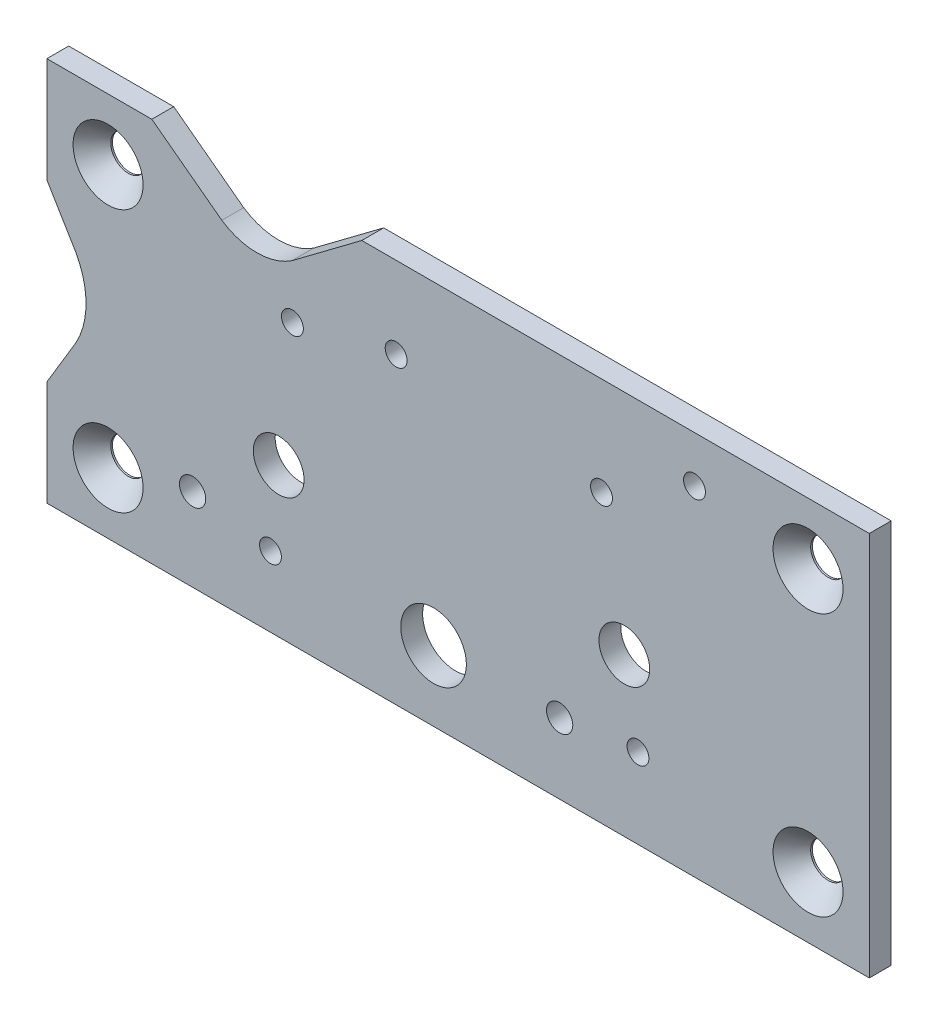
ISO-10303-21;
HEADER;
FILE_DESCRIPTION(('STEP AP214'),'2;1');
FILE_NAME('part.step','',(''),(''),'','','');
FILE_SCHEMA(('AUTOMOTIVE_DESIGN { 1 0 10303 214 1 1 1 1 }'));
ENDSEC;
DATA;
#1=APPLICATION_CONTEXT('core data for automotive mechanical design processes');
#2=APPLICATION_PROTOCOL_DEFINITION('international standard','automotive_design',2000,#1);
#3=PRODUCT_CONTEXT('',#1,'mechanical');
#4=PRODUCT('Part','Part','',(#3));
#5=PRODUCT_RELATED_PRODUCT_CATEGORY('part','',(#4));
#6=PRODUCT_DEFINITION_FORMATION('','',#4);
#7=PRODUCT_DEFINITION_CONTEXT('part definition',#1,'design');
#8=PRODUCT_DEFINITION('design','',#6,#7);
#9=PRODUCT_DEFINITION_SHAPE('','',#8);
#10=(LENGTH_UNIT() NAMED_UNIT(*) SI_UNIT(.MILLI.,.METRE.));
#11=(NAMED_UNIT(*) PLANE_ANGLE_UNIT() SI_UNIT($,.RADIAN.));
#12=(NAMED_UNIT(*) SI_UNIT($,.STERADIAN.) SOLID_ANGLE_UNIT());
#13=UNCERTAINTY_MEASURE_WITH_UNIT(LENGTH_MEASURE(1.E-05),#10,'distance_accuracy_value','');
#14=(GEOMETRIC_REPRESENTATION_CONTEXT(3) GLOBAL_UNCERTAINTY_ASSIGNED_CONTEXT((#13)) GLOBAL_UNIT_ASSIGNED_CONTEXT((#10,
#11,#12)) REPRESENTATION_CONTEXT('',''));
#15=CARTESIAN_POINT('',(0.,0.,0.));
#16=DIRECTION('',(0.,0.,1.));
#17=DIRECTION('',(1.,0.,0.));
#18=AXIS2_PLACEMENT_3D('',#15,#16,#17);
#19=CARTESIAN_POINT('',(47.,22.,0.));
#20=DIRECTION('',(0.,0.,-1.));
#21=DIRECTION('',(-1.,0.,0.));
#22=AXIS2_PLACEMENT_3D('',#19,#20,#21);
#23=PLANE('',#22);
#24=CARTESIAN_POINT('',(16.39527734,10.7721163,0.));
#25=DIRECTION('',(0.,0.,1.));
#26=DIRECTION('',(1.,0.,0.));
#27=AXIS2_PLACEMENT_3D('',#24,#25,#26);
#28=CIRCLE('',#27,1.24999999999999);
#29=CARTESIAN_POINT('',(17.64527734,10.7721163,0.));
#30=VERTEX_POINT('',#29);
#31=EDGE_CURVE('E755',#30,#30,#28,.T.);
#32=ORIENTED_EDGE('',*,*,#31,.F.);
#33=EDGE_LOOP('',(#32));
#34=FACE_BOUND('',#33,.T.);
#35=CARTESIAN_POINT('',(11.61273973,-13.9336995,0.));
#36=DIRECTION('',(0.,0.,1.));
#37=DIRECTION('',(1.,0.,0.));
#38=AXIS2_PLACEMENT_3D('',#35,#36,#37);
#39=CIRCLE('',#38,1.5);
#40=CARTESIAN_POINT('',(13.11273973,-13.9336995,0.));
#41=VERTEX_POINT('',#40);
#42=EDGE_CURVE('E759',#41,#41,#39,.T.);
#43=ORIENTED_EDGE('',*,*,#42,.F.);
#44=EDGE_LOOP('',(#43));
#45=FACE_BOUND('',#44,.T.);
#46=CARTESIAN_POINT('',(27.02597378,16.70830135,0.));
#47=DIRECTION('',(0.,0.,1.));
#48=DIRECTION('',(1.,0.,0.));
#49=AXIS2_PLACEMENT_3D('',#46,#47,#48);
#50=CIRCLE('',#49,1.24999999999999);
#51=CARTESIAN_POINT('',(28.27597378,16.70830135,0.));
#52=VERTEX_POINT('',#51);
#53=EDGE_CURVE('E775',#52,#52,#50,.T.);
#54=ORIENTED_EDGE('',*,*,#53,.F.);
#55=EDGE_LOOP('',(#54));
#56=FACE_BOUND('',#55,.T.);
#57=CARTESIAN_POINT('',(-30.339189,-12.51267994,0.));
#58=DIRECTION('',(0.,0.,1.));
#59=DIRECTION('',(1.,0.,0.));
#60=AXIS2_PLACEMENT_3D('',#57,#58,#59);
#61=CIRCLE('',#60,1.5);
#62=CARTESIAN_POINT('',(-28.839189,-12.51267994,0.));
#63=VERTEX_POINT('',#62);
#64=EDGE_CURVE('E707',#63,#63,#61,.T.);
#65=ORIENTED_EDGE('',*,*,#64,.F.);
#66=EDGE_LOOP('',(#65));
#67=FACE_BOUND('',#66,.T.);
#68=CARTESIAN_POINT('',(-18.93207305,9.91782843,0.));
#69=DIRECTION('',(0.,0.,1.));
#70=DIRECTION('',(1.,0.,0.));
#71=AXIS2_PLACEMENT_3D('',#68,#69,#70);
#72=CIRCLE('',#71,1.24999999999999);
#73=CARTESIAN_POINT('',(-17.68207305,9.91782843,0.));
#74=VERTEX_POINT('',#73);
#75=EDGE_CURVE('E721',#74,#74,#72,.T.);
#76=ORIENTED_EDGE('',*,*,#75,.F.);
#77=EDGE_LOOP('',(#76));
#78=FACE_BOUND('',#77,.T.);
#79=CARTESIAN_POINT('',(19.,-4.,0.));
#80=DIRECTION('',(0.,0.,1.));
#81=DIRECTION('',(1.,0.,0.));
#82=AXIS2_PLACEMENT_3D('',#79,#80,#81);
#83=CIRCLE('',#82,2.9);
#84=CARTESIAN_POINT('',(21.9,-4.,0.));
#85=VERTEX_POINT('',#84);
#86=EDGE_CURVE('E735',#85,#85,#83,.T.);
#87=ORIENTED_EDGE('',*,*,#86,.F.);
#88=EDGE_LOOP('',(#87));
#89=FACE_BOUND('',#88,.T.);
#90=CARTESIAN_POINT('',(-20.5,-5.,0.));
#91=DIRECTION('',(0.,0.,1.));
#92=DIRECTION('',(1.,0.,0.));
#93=AXIS2_PLACEMENT_3D('',#90,#91,#92);
#94=CIRCLE('',#93,2.9);
#95=CARTESIAN_POINT('',(-17.6,-5.,0.));
#96=VERTEX_POINT('',#95);
#97=EDGE_CURVE('E740',#96,#96,#94,.T.);
#98=ORIENTED_EDGE('',*,*,#97,.F.);
#99=EDGE_LOOP('',(#98));
#100=FACE_BOUND('',#99,.T.);
#101=CARTESIAN_POINT('',(-40.,-15.,0.));
#102=DIRECTION('',(0.,0.,1.));
#103=DIRECTION('',(1.,0.,0.));
#104=AXIS2_PLACEMENT_3D('',#101,#102,#103);
#105=CIRCLE('',#104,4.);
#106=CARTESIAN_POINT('',(-36.,-15.,0.));
#107=VERTEX_POINT('',#106);
#108=EDGE_CURVE('E249',#107,#107,#105,.T.);
#109=ORIENTED_EDGE('',*,*,#108,.F.);
#110=EDGE_LOOP('',(#109));
#111=FACE_BOUND('',#110,.T.);
#112=CARTESIAN_POINT('',(40.,-15.,0.));
#113=DIRECTION('',(0.,0.,1.));
#114=DIRECTION('',(1.,0.,0.));
#115=AXIS2_PLACEMENT_3D('',#112,#113,#114);
#116=CIRCLE('',#115,4.);
#117=CARTESIAN_POINT('',(44.,-15.,0.));
#118=VERTEX_POINT('',#117);
#119=EDGE_CURVE('E263',#118,#118,#116,.T.);
#120=ORIENTED_EDGE('',*,*,#119,.F.);
#121=EDGE_LOOP('',(#120));
#122=FACE_BOUND('',#121,.T.);
#123=CARTESIAN_POINT('',(40.,15.,0.));
#124=DIRECTION('',(0.,0.,1.));
#125=DIRECTION('',(1.,0.,0.));
#126=AXIS2_PLACEMENT_3D('',#123,#124,#125);
#127=CIRCLE('',#126,4.);
#128=CARTESIAN_POINT('',(44.,15.,0.));
#129=VERTEX_POINT('',#128);
#130=EDGE_CURVE('E275',#129,#129,#127,.T.);
#131=ORIENTED_EDGE('',*,*,#130,.F.);
#132=EDGE_LOOP('',(#131));
#133=FACE_BOUND('',#132,.T.);
#134=CARTESIAN_POINT('',(-40.,15.,0.));
#135=DIRECTION('',(0.,0.,1.));
#136=DIRECTION('',(1.,0.,0.));
#137=AXIS2_PLACEMENT_3D('',#134,#135,#136);
#138=CIRCLE('',#137,4.);
#139=CARTESIAN_POINT('',(-36.,15.,0.));
#140=VERTEX_POINT('',#139);
#141=EDGE_CURVE('E287',#140,#140,#138,.T.);
#142=ORIENTED_EDGE('',*,*,#141,.F.);
#143=EDGE_LOOP('',(#142));
#144=FACE_BOUND('',#143,.T.);
#145=CARTESIAN_POINT('',(-2.8,-14.,0.));
#146=DIRECTION('',(0.,0.,1.));
#147=DIRECTION('',(1.,0.,0.));
#148=AXIS2_PLACEMENT_3D('',#145,#146,#147);
#149=CIRCLE('',#148,3.75);
#150=CARTESIAN_POINT('',(0.949999999999999,-14.,0.));
#151=VERTEX_POINT('',#150);
#152=EDGE_CURVE('E244',#151,#151,#149,.T.);
#153=ORIENTED_EDGE('',*,*,#152,.F.);
#154=EDGE_LOOP('',(#153));
#155=FACE_BOUND('',#154,.T.);
#156=DIRECTION('',(-0.514495755427526,0.857492925712544,0.));
#157=VECTOR('',#156,1.);
#158=CARTESIAN_POINT('',(-27.4117647058824,-22.6470588235294,0.));
#159=LINE('',#158,#157);
#160=CARTESIAN_POINT('',(-43.7,4.5,0.));
#161=VERTEX_POINT('',#160);
#162=CARTESIAN_POINT('',(-47.,10.,0.));
#163=VERTEX_POINT('',#162);
#164=EDGE_CURVE('E219',#161,#163,#159,.T.);
#165=ORIENTED_EDGE('',*,*,#164,.F.);
#166=CARTESIAN_POINT('',(-51.6849831223143,0.,0.));
#167=DIRECTION('',(0.,0.,-1.));
#168=DIRECTION('',(-1.,0.,0.));
#169=AXIS2_PLACEMENT_3D('',#166,#167,#168);
#170=CIRCLE('',#169,9.16569448888863);
#171=CARTESIAN_POINT('',(-43.7,-4.5,0.));
#172=VERTEX_POINT('',#171);
#173=EDGE_CURVE('E143',#172,#161,#170,.F.);
#174=ORIENTED_EDGE('',*,*,#173,.F.);
#175=DIRECTION('',(0.514495755427526,0.857492925712544,0.));
#176=VECTOR('',#175,1.);
#177=CARTESIAN_POINT('',(-8.00000000000003,55.,0.));
#178=LINE('',#177,#176);
#179=CARTESIAN_POINT('',(-47.,-10.,0.));
#180=VERTEX_POINT('',#179);
#181=EDGE_CURVE('E128',#180,#172,#178,.T.);
#182=ORIENTED_EDGE('',*,*,#181,.F.);
#183=DIRECTION('',(0.,-1.,0.));
#184=VECTOR('',#183,1.);
#185=CARTESIAN_POINT('',(-47.,-22.,0.));
#186=LINE('',#185,#184);
#187=CARTESIAN_POINT('',(-47.,-22.,0.));
#188=VERTEX_POINT('',#187);
#189=EDGE_CURVE('E141',#180,#188,#186,.T.);
#190=ORIENTED_EDGE('',*,*,#189,.T.);
#191=DIRECTION('',(1.,0.,0.));
#192=VECTOR('',#191,1.);
#193=CARTESIAN_POINT('',(-47.,-22.,0.));
#194=LINE('',#193,#192);
#195=CARTESIAN_POINT('',(47.,-22.,0.));
#196=VERTEX_POINT('',#195);
#197=EDGE_CURVE('E159',#188,#196,#194,.T.);
#198=ORIENTED_EDGE('',*,*,#197,.T.);
#199=DIRECTION('',(0.,1.,0.));
#200=VECTOR('',#199,1.);
#201=CARTESIAN_POINT('',(47.,-22.,0.));
#202=LINE('',#201,#200);
#203=CARTESIAN_POINT('',(47.,22.,0.));
#204=VERTEX_POINT('',#203);
#205=EDGE_CURVE('E299',#196,#204,#202,.T.);
#206=ORIENTED_EDGE('',*,*,#205,.T.);
#207=DIRECTION('',(-1.,0.,0.));
#208=VECTOR('',#207,1.);
#209=CARTESIAN_POINT('',(-47.,22.,0.));
#210=LINE('',#209,#208);
#211=CARTESIAN_POINT('',(-11.,22.,0.));
#212=VERTEX_POINT('',#211);
#213=EDGE_CURVE('E153',#204,#212,#210,.T.);
#214=ORIENTED_EDGE('',*,*,#213,.T.);
#215=DIRECTION('',(-0.8,-0.6,0.));
#216=VECTOR('',#215,1.);
#217=CARTESIAN_POINT('',(26.12,49.84,0.));
#218=LINE('',#217,#216);
#219=CARTESIAN_POINT('',(-19.,16.,0.));
#220=VERTEX_POINT('',#219);
#221=EDGE_CURVE('E237',#212,#220,#218,.T.);
#222=ORIENTED_EDGE('',*,*,#221,.T.);
#223=CARTESIAN_POINT('',(-23.,21.9922650013123,0.));
#224=DIRECTION('',(0.,0.,-1.));
#225=DIRECTION('',(-1.,0.,0.));
#226=AXIS2_PLACEMENT_3D('',#223,#224,#225);
#227=CIRCLE('',#226,7.20466792058815);
#228=CARTESIAN_POINT('',(-27.,16.,0.));
#229=VERTEX_POINT('',#228);
#230=EDGE_CURVE('E61',#220,#229,#227,.T.);
#231=ORIENTED_EDGE('',*,*,#230,.T.);
#232=DIRECTION('',(-0.8,0.6,0.));
#233=VECTOR('',#232,1.);
#234=CARTESIAN_POINT('',(17.48,-17.36,0.));
#235=LINE('',#234,#233);
#236=CARTESIAN_POINT('',(-35.,22.,0.));
#237=VERTEX_POINT('',#236);
#238=EDGE_CURVE('E242',#229,#237,#235,.T.);
#239=ORIENTED_EDGE('',*,*,#238,.T.);
#240=CARTESIAN_POINT('',(-47.,22.,0.));
#241=VERTEX_POINT('',#240);
#242=EDGE_CURVE('E162',#237,#241,#210,.T.);
#243=ORIENTED_EDGE('',*,*,#242,.T.);
#244=EDGE_CURVE('E152',#241,#163,#186,.T.);
#245=ORIENTED_EDGE('',*,*,#244,.T.);
#246=EDGE_LOOP('',(#165,#174,#182,#190,#198,#206,#214,#222,#231,#239,#243,#245));
#247=FACE_BOUND('',#246,.T.);
#248=CARTESIAN_POINT('',(-21.44075617,-13.95069706,0.));
#249=DIRECTION('',(0.,0.,1.));
#250=DIRECTION('',(1.,0.,0.));
#251=AXIS2_PLACEMENT_3D('',#248,#249,#250);
#252=CIRCLE('',#251,1.24999999999999);
#253=CARTESIAN_POINT('',(-20.19075617,-13.95069706,0.));
#254=VERTEX_POINT('',#253);
#255=EDGE_CURVE('E713',#254,#254,#252,.T.);
#256=ORIENTED_EDGE('',*,*,#255,.F.);
#257=EDGE_LOOP('',(#256));
#258=FACE_BOUND('',#257,.T.);
#259=CARTESIAN_POINT('',(-7.0769574,12.69383868,0.));
#260=DIRECTION('',(0.,0.,1.));
#261=DIRECTION('',(1.,0.,0.));
#262=AXIS2_PLACEMENT_3D('',#259,#260,#261);
#263=CIRCLE('',#262,1.24999999999999);
#264=CARTESIAN_POINT('',(-5.82695740000001,12.69383868,0.));
#265=VERTEX_POINT('',#264);
#266=EDGE_CURVE('E725',#265,#265,#263,.T.);
#267=ORIENTED_EDGE('',*,*,#266,.F.);
#268=EDGE_LOOP('',(#267));
#269=FACE_BOUND('',#268,.T.);
#270=CARTESIAN_POINT('',(20.5628336,-12.86326978,0.));
#271=DIRECTION('',(0.,0.,1.));
#272=DIRECTION('',(1.,0.,0.));
#273=AXIS2_PLACEMENT_3D('',#270,#271,#272);
#274=CIRCLE('',#273,1.24999999999999);
#275=CARTESIAN_POINT('',(21.8128336,-12.86326978,0.));
#276=VERTEX_POINT('',#275);
#277=EDGE_CURVE('E756',#276,#276,#274,.T.);
#278=ORIENTED_EDGE('',*,*,#277,.F.);
#279=EDGE_LOOP('',(#278));
#280=FACE_BOUND('',#279,.T.);
#281=ADVANCED_FACE('F37',(#34,#45,#56,#67,#78,#89,#100,#111,#122,#133,#144,#155,#247,#258,#269,
#280),#23,.F.);
#282=CARTESIAN_POINT('',(47.,22.,-2.5));
#283=DIRECTION('',(0.,0.,-1.));
#284=DIRECTION('',(-1.,0.,0.));
#285=AXIS2_PLACEMENT_3D('',#282,#283,#284);
#286=PLANE('',#285);
#287=CARTESIAN_POINT('',(27.02597378,16.70830135,-2.5));
#288=DIRECTION('',(0.,0.,1.));
#289=DIRECTION('',(1.,0.,0.));
#290=AXIS2_PLACEMENT_3D('',#287,#288,#289);
#291=CIRCLE('',#290,1.25);
#292=CARTESIAN_POINT('',(28.27597378,16.70830135,-2.5));
#293=VERTEX_POINT('',#292);
#294=EDGE_CURVE('E710',#293,#293,#291,.T.);
#295=ORIENTED_EDGE('',*,*,#294,.T.);
#296=EDGE_LOOP('',(#295));
#297=FACE_BOUND('',#296,.T.);
#298=CARTESIAN_POINT('',(-30.339189,-12.51267994,-2.5));
#299=DIRECTION('',(0.,0.,1.));
#300=DIRECTION('',(1.,0.,0.));
#301=AXIS2_PLACEMENT_3D('',#298,#299,#300);
#302=CIRCLE('',#301,1.5);
#303=CARTESIAN_POINT('',(-28.839189,-12.51267994,-2.5));
#304=VERTEX_POINT('',#303);
#305=EDGE_CURVE('E709',#304,#304,#302,.T.);
#306=ORIENTED_EDGE('',*,*,#305,.T.);
#307=EDGE_LOOP('',(#306));
#308=FACE_BOUND('',#307,.T.);
#309=CARTESIAN_POINT('',(-7.0769574,12.69383868,-2.5));
#310=DIRECTION('',(0.,0.,1.));
#311=DIRECTION('',(1.,0.,0.));
#312=AXIS2_PLACEMENT_3D('',#309,#310,#311);
#313=CIRCLE('',#312,1.25);
#314=CARTESIAN_POINT('',(-5.8269574,12.69383868,-2.5));
#315=VERTEX_POINT('',#314);
#316=EDGE_CURVE('E716',#315,#315,#313,.T.);
#317=ORIENTED_EDGE('',*,*,#316,.T.);
#318=EDGE_LOOP('',(#317));
#319=FACE_BOUND('',#318,.T.);
#320=CARTESIAN_POINT('',(-18.93207305,9.91782843,-2.5));
#321=DIRECTION('',(0.,0.,1.));
#322=DIRECTION('',(1.,0.,0.));
#323=AXIS2_PLACEMENT_3D('',#320,#321,#322);
#324=CIRCLE('',#323,1.25);
#325=CARTESIAN_POINT('',(-17.68207305,9.91782843,-2.5));
#326=VERTEX_POINT('',#325);
#327=EDGE_CURVE('E731',#326,#326,#324,.T.);
#328=ORIENTED_EDGE('',*,*,#327,.T.);
#329=EDGE_LOOP('',(#328));
#330=FACE_BOUND('',#329,.T.);
#331=CARTESIAN_POINT('',(19.,-4.,-2.5));
#332=DIRECTION('',(0.,0.,1.));
#333=DIRECTION('',(1.,0.,0.));
#334=AXIS2_PLACEMENT_3D('',#331,#332,#333);
#335=CIRCLE('',#334,2.9);
#336=CARTESIAN_POINT('',(21.9,-4.,-2.5));
#337=VERTEX_POINT('',#336);
#338=EDGE_CURVE('E736',#337,#337,#335,.T.);
#339=ORIENTED_EDGE('',*,*,#338,.T.);
#340=EDGE_LOOP('',(#339));
#341=FACE_BOUND('',#340,.T.);
#342=CARTESIAN_POINT('',(-20.5,-5.,-2.5));
#343=DIRECTION('',(0.,0.,1.));
#344=DIRECTION('',(1.,0.,0.));
#345=AXIS2_PLACEMENT_3D('',#342,#343,#344);
#346=CIRCLE('',#345,2.9);
#347=CARTESIAN_POINT('',(-17.6,-5.,-2.5));
#348=VERTEX_POINT('',#347);
#349=EDGE_CURVE('E135',#348,#348,#346,.T.);
#350=ORIENTED_EDGE('',*,*,#349,.T.);
#351=EDGE_LOOP('',(#350));
#352=FACE_BOUND('',#351,.T.);
#353=CARTESIAN_POINT('',(-40.,15.,-2.5));
#354=DIRECTION('',(0.,0.,1.));
#355=DIRECTION('',(1.,0.,0.));
#356=AXIS2_PLACEMENT_3D('',#353,#354,#355);
#357=CIRCLE('',#356,2.);
#358=CARTESIAN_POINT('',(-38.,15.,-2.5));
#359=VERTEX_POINT('',#358);
#360=EDGE_CURVE('E295',#359,#359,#357,.T.);
#361=ORIENTED_EDGE('',*,*,#360,.T.);
#362=EDGE_LOOP('',(#361));
#363=FACE_BOUND('',#362,.T.);
#364=CARTESIAN_POINT('',(40.,15.,-2.5));
#365=DIRECTION('',(0.,0.,1.));
#366=DIRECTION('',(1.,0.,0.));
#367=AXIS2_PLACEMENT_3D('',#364,#365,#366);
#368=CIRCLE('',#367,2.);
#369=CARTESIAN_POINT('',(42.,15.,-2.5));
#370=VERTEX_POINT('',#369);
#371=EDGE_CURVE('E283',#370,#370,#368,.T.);
#372=ORIENTED_EDGE('',*,*,#371,.T.);
#373=EDGE_LOOP('',(#372));
#374=FACE_BOUND('',#373,.T.);
#375=CARTESIAN_POINT('',(40.,-15.,-2.5));
#376=DIRECTION('',(0.,0.,1.));
#377=DIRECTION('',(1.,0.,0.));
#378=AXIS2_PLACEMENT_3D('',#375,#376,#377);
#379=CIRCLE('',#378,2.);
#380=CARTESIAN_POINT('',(42.,-15.,-2.5));
#381=VERTEX_POINT('',#380);
#382=EDGE_CURVE('E271',#381,#381,#379,.T.);
#383=ORIENTED_EDGE('',*,*,#382,.T.);
#384=EDGE_LOOP('',(#383));
#385=FACE_BOUND('',#384,.T.);
#386=CARTESIAN_POINT('',(-40.,-15.,-2.5));
#387=DIRECTION('',(0.,0.,1.));
#388=DIRECTION('',(1.,0.,0.));
#389=AXIS2_PLACEMENT_3D('',#386,#387,#388);
#390=CIRCLE('',#389,2.);
#391=CARTESIAN_POINT('',(-38.,-15.,-2.5));
#392=VERTEX_POINT('',#391);
#393=EDGE_CURVE('E259',#392,#392,#390,.T.);
#394=ORIENTED_EDGE('',*,*,#393,.T.);
#395=EDGE_LOOP('',(#394));
#396=FACE_BOUND('',#395,.T.);
#397=CARTESIAN_POINT('',(-2.8,-14.,-2.5));
#398=DIRECTION('',(0.,0.,1.));
#399=DIRECTION('',(1.,0.,0.));
#400=AXIS2_PLACEMENT_3D('',#397,#398,#399);
#401=CIRCLE('',#400,3.75);
#402=CARTESIAN_POINT('',(0.949999999999999,-14.,-2.5));
#403=VERTEX_POINT('',#402);
#404=EDGE_CURVE('E245',#403,#403,#401,.T.);
#405=ORIENTED_EDGE('',*,*,#404,.T.);
#406=EDGE_LOOP('',(#405));
#407=FACE_BOUND('',#406,.T.);
#408=CARTESIAN_POINT('',(-51.6849831223143,0.,-2.5));
#409=DIRECTION('',(0.,0.,-1.));
#410=DIRECTION('',(-1.,0.,0.));
#411=AXIS2_PLACEMENT_3D('',#408,#409,#410);
#412=CIRCLE('',#411,9.16569448888863);
#413=CARTESIAN_POINT('',(-43.7,-4.5,-2.5));
#414=VERTEX_POINT('',#413);
#415=CARTESIAN_POINT('',(-43.7,4.5,-2.5));
#416=VERTEX_POINT('',#415);
#417=EDGE_CURVE('E46',#414,#416,#412,.F.);
#418=ORIENTED_EDGE('',*,*,#417,.T.);
#419=DIRECTION('',(-0.514495755427526,0.857492925712544,0.));
#420=VECTOR('',#419,1.);
#421=CARTESIAN_POINT('',(-27.4117647058824,-22.6470588235294,-2.5));
#422=LINE('',#421,#420);
#423=CARTESIAN_POINT('',(-47.,10.,-2.5));
#424=VERTEX_POINT('',#423);
#425=EDGE_CURVE('E11',#416,#424,#422,.T.);
#426=ORIENTED_EDGE('',*,*,#425,.T.);
#427=DIRECTION('',(0.,-1.,0.));
#428=VECTOR('',#427,1.);
#429=CARTESIAN_POINT('',(-47.,-22.,-2.5));
#430=LINE('',#429,#428);
#431=CARTESIAN_POINT('',(-47.,22.,-2.5));
#432=VERTEX_POINT('',#431);
#433=EDGE_CURVE('E308',#432,#424,#430,.T.);
#434=ORIENTED_EDGE('',*,*,#433,.F.);
#435=DIRECTION('',(-1.,0.,0.));
#436=VECTOR('',#435,1.);
#437=CARTESIAN_POINT('',(-47.,22.,-2.5));
#438=LINE('',#437,#436);
#439=CARTESIAN_POINT('',(-35.,22.,-2.5));
#440=VERTEX_POINT('',#439);
#441=EDGE_CURVE('E303',#440,#432,#438,.T.);
#442=ORIENTED_EDGE('',*,*,#441,.F.);
#443=DIRECTION('',(-0.8,0.6,0.));
#444=VECTOR('',#443,1.);
#445=CARTESIAN_POINT('',(17.48,-17.36,-2.5));
#446=LINE('',#445,#444);
#447=CARTESIAN_POINT('',(-27.,16.,-2.5));
#448=VERTEX_POINT('',#447);
#449=EDGE_CURVE('E190',#448,#440,#446,.T.);
#450=ORIENTED_EDGE('',*,*,#449,.F.);
#451=CARTESIAN_POINT('',(-23.,21.9922650013123,-2.5));
#452=DIRECTION('',(0.,0.,-1.));
#453=DIRECTION('',(-1.,0.,0.));
#454=AXIS2_PLACEMENT_3D('',#451,#452,#453);
#455=CIRCLE('',#454,7.20466792058815);
#456=CARTESIAN_POINT('',(-19.,16.,-2.5));
#457=VERTEX_POINT('',#456);
#458=EDGE_CURVE('E186',#457,#448,#455,.T.);
#459=ORIENTED_EDGE('',*,*,#458,.F.);
#460=DIRECTION('',(-0.8,-0.6,0.));
#461=VECTOR('',#460,1.);
#462=CARTESIAN_POINT('',(26.12,49.84,-2.5));
#463=LINE('',#462,#461);
#464=CARTESIAN_POINT('',(-11.0000000000001,22.,-2.5));
#465=VERTEX_POINT('',#464);
#466=EDGE_CURVE('E172',#465,#457,#463,.T.);
#467=ORIENTED_EDGE('',*,*,#466,.F.);
#468=CARTESIAN_POINT('',(47.,22.,-2.5));
#469=VERTEX_POINT('',#468);
#470=EDGE_CURVE('E304',#469,#465,#438,.T.);
#471=ORIENTED_EDGE('',*,*,#470,.F.);
#472=DIRECTION('',(0.,1.,0.));
#473=VECTOR('',#472,1.);
#474=CARTESIAN_POINT('',(47.,-22.,-2.5));
#475=LINE('',#474,#473);
#476=CARTESIAN_POINT('',(47.,-22.,-2.5));
#477=VERTEX_POINT('',#476);
#478=EDGE_CURVE('E168',#477,#469,#475,.T.);
#479=ORIENTED_EDGE('',*,*,#478,.F.);
#480=DIRECTION('',(1.,0.,0.));
#481=VECTOR('',#480,1.);
#482=CARTESIAN_POINT('',(-47.,-22.,-2.5));
#483=LINE('',#482,#481);
#484=CARTESIAN_POINT('',(-47.,-22.,-2.5));
#485=VERTEX_POINT('',#484);
#486=EDGE_CURVE('E182',#485,#477,#483,.T.);
#487=ORIENTED_EDGE('',*,*,#486,.F.);
#488=CARTESIAN_POINT('',(-47.,-10.,-2.5));
#489=VERTEX_POINT('',#488);
#490=EDGE_CURVE('E307',#489,#485,#430,.T.);
#491=ORIENTED_EDGE('',*,*,#490,.F.);
#492=DIRECTION('',(0.514495755427526,0.857492925712544,0.));
#493=VECTOR('',#492,1.);
#494=CARTESIAN_POINT('',(-8.00000000000003,55.,-2.5));
#495=LINE('',#494,#493);
#496=EDGE_CURVE('E130',#489,#414,#495,.T.);
#497=ORIENTED_EDGE('',*,*,#496,.T.);
#498=EDGE_LOOP('',(#418,#426,#434,#442,#450,#459,#467,#471,#479,#487,#491,#497));
#499=FACE_BOUND('',#498,.T.);
#500=CARTESIAN_POINT('',(-21.44075617,-13.95069706,-2.5));
#501=DIRECTION('',(0.,0.,1.));
#502=DIRECTION('',(1.,0.,0.));
#503=AXIS2_PLACEMENT_3D('',#500,#501,#502);
#504=CIRCLE('',#503,1.25);
#505=CARTESIAN_POINT('',(-20.19075617,-13.95069706,-2.5));
#506=VERTEX_POINT('',#505);
#507=EDGE_CURVE('E715',#506,#506,#504,.T.);
#508=ORIENTED_EDGE('',*,*,#507,.T.);
#509=EDGE_LOOP('',(#508));
#510=FACE_BOUND('',#509,.T.);
#511=CARTESIAN_POINT('',(11.61273973,-13.9336995,-2.5));
#512=DIRECTION('',(0.,0.,1.));
#513=DIRECTION('',(1.,0.,0.));
#514=AXIS2_PLACEMENT_3D('',#511,#512,#513);
#515=CIRCLE('',#514,1.5);
#516=CARTESIAN_POINT('',(13.11273973,-13.9336995,-2.5));
#517=VERTEX_POINT('',#516);
#518=EDGE_CURVE('E762',#517,#517,#515,.T.);
#519=ORIENTED_EDGE('',*,*,#518,.T.);
#520=EDGE_LOOP('',(#519));
#521=FACE_BOUND('',#520,.T.);
#522=CARTESIAN_POINT('',(16.39527734,10.7721163,-2.5));
#523=DIRECTION('',(0.,0.,1.));
#524=DIRECTION('',(1.,0.,0.));
#525=AXIS2_PLACEMENT_3D('',#522,#523,#524);
#526=CIRCLE('',#525,1.25);
#527=CARTESIAN_POINT('',(17.64527734,10.7721163,-2.5));
#528=VERTEX_POINT('',#527);
#529=EDGE_CURVE('E763',#528,#528,#526,.T.);
#530=ORIENTED_EDGE('',*,*,#529,.T.);
#531=EDGE_LOOP('',(#530));
#532=FACE_BOUND('',#531,.T.);
#533=CARTESIAN_POINT('',(20.5628336,-12.86326978,-2.5));
#534=DIRECTION('',(0.,0.,1.));
#535=DIRECTION('',(1.,0.,0.));
#536=AXIS2_PLACEMENT_3D('',#533,#534,#535);
#537=CIRCLE('',#536,1.25);
#538=CARTESIAN_POINT('',(21.8128336,-12.86326978,-2.5));
#539=VERTEX_POINT('',#538);
#540=EDGE_CURVE('E753',#539,#539,#537,.T.);
#541=ORIENTED_EDGE('',*,*,#540,.T.);
#542=EDGE_LOOP('',(#541));
#543=FACE_BOUND('',#542,.T.);
#544=ADVANCED_FACE('F199',(#297,#308,#319,#330,#341,#352,#363,#374,#385,#396,#407,#499,#510,
#521,#532,#543),#286,.T.);
#545=CARTESIAN_POINT('',(-47.,-22.,-2.5));
#546=DIRECTION('',(-1.,0.,0.));
#547=DIRECTION('',(0.,0.,1.));
#548=AXIS2_PLACEMENT_3D('',#545,#546,#547);
#549=PLANE('',#548);
#550=ORIENTED_EDGE('',*,*,#433,.T.);
#551=DIRECTION('',(0.,0.,-1.));
#552=VECTOR('',#551,1.);
#553=CARTESIAN_POINT('',(-47.,10.,132.897938723757));
#554=LINE('',#553,#552);
#555=EDGE_CURVE('E145',#163,#424,#554,.T.);
#556=ORIENTED_EDGE('',*,*,#555,.F.);
#557=ORIENTED_EDGE('',*,*,#244,.F.);
#558=DIRECTION('',(0.,0.,1.));
#559=VECTOR('',#558,1.);
#560=CARTESIAN_POINT('',(-47.,22.,-2.5));
#561=LINE('',#560,#559);
#562=EDGE_CURVE('E175',#432,#241,#561,.T.);
#563=ORIENTED_EDGE('',*,*,#562,.F.);
#564=EDGE_LOOP('',(#550,#556,#557,#563));
#565=FACE_BOUND('',#564,.T.);
#566=ADVANCED_FACE('F328',(#565),#549,.T.);
#567=ORIENTED_EDGE('',*,*,#189,.F.);
#568=DIRECTION('',(0.,0.,-1.));
#569=VECTOR('',#568,1.);
#570=CARTESIAN_POINT('',(-47.,-10.,132.897938723757));
#571=LINE('',#570,#569);
#572=EDGE_CURVE('E125',#180,#489,#571,.T.);
#573=ORIENTED_EDGE('',*,*,#572,.T.);
#574=ORIENTED_EDGE('',*,*,#490,.T.);
#575=DIRECTION('',(0.,0.,1.));
#576=VECTOR('',#575,1.);
#577=CARTESIAN_POINT('',(-47.,-22.,-2.5));
#578=LINE('',#577,#576);
#579=EDGE_CURVE('E149',#485,#188,#578,.T.);
#580=ORIENTED_EDGE('',*,*,#579,.T.);
#581=EDGE_LOOP('',(#567,#573,#574,#580));
#582=FACE_BOUND('',#581,.T.);
#583=ADVANCED_FACE('F147',(#582),#549,.T.);
#584=CARTESIAN_POINT('',(-47.,22.,-2.5));
#585=DIRECTION('',(0.,1.,0.));
#586=DIRECTION('',(0.,0.,1.));
#587=AXIS2_PLACEMENT_3D('',#584,#585,#586);
#588=PLANE('',#587);
#589=DIRECTION('',(0.,0.,-1.));
#590=VECTOR('',#589,1.);
#591=CARTESIAN_POINT('',(-35.,22.,129.772938723757));
#592=LINE('',#591,#590);
#593=EDGE_CURVE('E234',#237,#440,#592,.T.);
#594=ORIENTED_EDGE('',*,*,#593,.T.);
#595=ORIENTED_EDGE('',*,*,#441,.T.);
#596=ORIENTED_EDGE('',*,*,#562,.T.);
#597=ORIENTED_EDGE('',*,*,#242,.F.);
#598=EDGE_LOOP('',(#594,#595,#596,#597));
#599=FACE_BOUND('',#598,.T.);
#600=ADVANCED_FACE('F324',(#599),#588,.T.);
#601=CARTESIAN_POINT('',(47.,-22.,-2.5));
#602=DIRECTION('',(1.,0.,0.));
#603=DIRECTION('',(0.,0.,-1.));
#604=AXIS2_PLACEMENT_3D('',#601,#602,#603);
#605=PLANE('',#604);
#606=ORIENTED_EDGE('',*,*,#205,.F.);
#607=DIRECTION('',(0.,0.,1.));
#608=VECTOR('',#607,1.);
#609=CARTESIAN_POINT('',(47.,-22.,-2.5));
#610=LINE('',#609,#608);
#611=EDGE_CURVE('E169',#477,#196,#610,.T.);
#612=ORIENTED_EDGE('',*,*,#611,.F.);
#613=ORIENTED_EDGE('',*,*,#478,.T.);
#614=DIRECTION('',(0.,0.,1.));
#615=VECTOR('',#614,1.);
#616=CARTESIAN_POINT('',(47.,22.,-2.5));
#617=LINE('',#616,#615);
#618=EDGE_CURVE('E179',#469,#204,#617,.T.);
#619=ORIENTED_EDGE('',*,*,#618,.T.);
#620=EDGE_LOOP('',(#606,#612,#613,#619));
#621=FACE_BOUND('',#620,.T.);
#622=ADVANCED_FACE('F39',(#621),#605,.T.);
#623=CARTESIAN_POINT('',(-47.,-22.,-2.5));
#624=DIRECTION('',(0.,-1.,0.));
#625=DIRECTION('',(0.,0.,-1.));
#626=AXIS2_PLACEMENT_3D('',#623,#624,#625);
#627=PLANE('',#626);
#628=ORIENTED_EDGE('',*,*,#197,.F.);
#629=ORIENTED_EDGE('',*,*,#579,.F.);
#630=ORIENTED_EDGE('',*,*,#486,.T.);
#631=ORIENTED_EDGE('',*,*,#611,.T.);
#632=EDGE_LOOP('',(#628,#629,#630,#631));
#633=FACE_BOUND('',#632,.T.);
#634=ADVANCED_FACE('F353',(#633),#627,.T.);
#635=DIRECTION('',(0.,0.,-1.));
#636=VECTOR('',#635,1.);
#637=CARTESIAN_POINT('',(-11.,22.,129.772938723757));
#638=LINE('',#637,#636);
#639=EDGE_CURVE('E222',#212,#465,#638,.T.);
#640=ORIENTED_EDGE('',*,*,#639,.F.);
#641=ORIENTED_EDGE('',*,*,#213,.F.);
#642=ORIENTED_EDGE('',*,*,#618,.F.);
#643=ORIENTED_EDGE('',*,*,#470,.T.);
#644=EDGE_LOOP('',(#640,#641,#642,#643));
#645=FACE_BOUND('',#644,.T.);
#646=ADVANCED_FACE('F356',(#645),#588,.T.);
#647=CARTESIAN_POINT('',(-40.,15.,0.));
#648=DIRECTION('',(0.,0.,1.));
#649=DIRECTION('',(1.,0.,0.));
#650=AXIS2_PLACEMENT_3D('',#647,#648,#649);
#651=CYLINDRICAL_SURFACE('',#650,2.);
#652=ORIENTED_EDGE('',*,*,#360,.F.);
#653=EDGE_LOOP('',(#652));
#654=FACE_BOUND('',#653,.T.);
#655=CARTESIAN_POINT('',(-40.,15.,-2.30073681444201));
#656=DIRECTION('',(0.,0.,1.));
#657=DIRECTION('',(1.,0.,0.));
#658=AXIS2_PLACEMENT_3D('',#655,#656,#657);
#659=CIRCLE('',#658,2.);
#660=CARTESIAN_POINT('',(-38.,15.,-2.30073681444201));
#661=VERTEX_POINT('',#660);
#662=EDGE_CURVE('E291',#661,#661,#659,.T.);
#663=ORIENTED_EDGE('',*,*,#662,.T.);
#664=EDGE_LOOP('',(#663));
#665=FACE_BOUND('',#664,.T.);
#666=ADVANCED_FACE('F360',(#654,#665),#651,.F.);
#667=CARTESIAN_POINT('',(-40.,15.,0.));
#668=DIRECTION('',(0.,0.,1.));
#669=DIRECTION('',(1.,0.,0.));
#670=AXIS2_PLACEMENT_3D('',#667,#668,#669);
#671=CONICAL_SURFACE('',#670,4.,0.715584993317675);
#672=ORIENTED_EDGE('',*,*,#662,.F.);
#673=EDGE_LOOP('',(#672));
#674=FACE_BOUND('',#673,.T.);
#675=ORIENTED_EDGE('',*,*,#141,.T.);
#676=EDGE_LOOP('',(#675));
#677=FACE_BOUND('',#676,.T.);
#678=ADVANCED_FACE('F365',(#674,#677),#671,.F.);
#679=CARTESIAN_POINT('',(40.,15.,0.));
#680=DIRECTION('',(0.,0.,1.));
#681=DIRECTION('',(1.,0.,0.));
#682=AXIS2_PLACEMENT_3D('',#679,#680,#681);
#683=CYLINDRICAL_SURFACE('',#682,2.);
#684=ORIENTED_EDGE('',*,*,#371,.F.);
#685=EDGE_LOOP('',(#684));
#686=FACE_BOUND('',#685,.T.);
#687=CARTESIAN_POINT('',(40.,15.,-2.30073681444201));
#688=DIRECTION('',(0.,0.,1.));
#689=DIRECTION('',(1.,0.,0.));
#690=AXIS2_PLACEMENT_3D('',#687,#688,#689);
#691=CIRCLE('',#690,2.);
#692=CARTESIAN_POINT('',(42.,15.,-2.30073681444201));
#693=VERTEX_POINT('',#692);
#694=EDGE_CURVE('E279',#693,#693,#691,.T.);
#695=ORIENTED_EDGE('',*,*,#694,.T.);
#696=EDGE_LOOP('',(#695));
#697=FACE_BOUND('',#696,.T.);
#698=ADVANCED_FACE('F610',(#686,#697),#683,.F.);
#699=CARTESIAN_POINT('',(40.,15.,0.));
#700=DIRECTION('',(0.,0.,1.));
#701=DIRECTION('',(1.,0.,0.));
#702=AXIS2_PLACEMENT_3D('',#699,#700,#701);
#703=CONICAL_SURFACE('',#702,4.,0.715584993317674);
#704=ORIENTED_EDGE('',*,*,#694,.F.);
#705=EDGE_LOOP('',(#704));
#706=FACE_BOUND('',#705,.T.);
#707=ORIENTED_EDGE('',*,*,#130,.T.);
#708=EDGE_LOOP('',(#707));
#709=FACE_BOUND('',#708,.T.);
#710=ADVANCED_FACE('F600',(#706,#709),#703,.F.);
#711=CARTESIAN_POINT('',(40.,-15.,0.));
#712=DIRECTION('',(0.,0.,1.));
#713=DIRECTION('',(1.,0.,0.));
#714=AXIS2_PLACEMENT_3D('',#711,#712,#713);
#715=CYLINDRICAL_SURFACE('',#714,2.);
#716=ORIENTED_EDGE('',*,*,#382,.F.);
#717=EDGE_LOOP('',(#716));
#718=FACE_BOUND('',#717,.T.);
#719=CARTESIAN_POINT('',(40.,-15.,-2.30073681444201));
#720=DIRECTION('',(0.,0.,1.));
#721=DIRECTION('',(1.,0.,0.));
#722=AXIS2_PLACEMENT_3D('',#719,#720,#721);
#723=CIRCLE('',#722,2.);
#724=CARTESIAN_POINT('',(42.,-15.,-2.30073681444201));
#725=VERTEX_POINT('',#724);
#726=EDGE_CURVE('E267',#725,#725,#723,.T.);
#727=ORIENTED_EDGE('',*,*,#726,.T.);
#728=EDGE_LOOP('',(#727));
#729=FACE_BOUND('',#728,.T.);
#730=ADVANCED_FACE('F590',(#718,#729),#715,.F.);
#731=CARTESIAN_POINT('',(40.,-15.,0.));
#732=DIRECTION('',(0.,0.,1.));
#733=DIRECTION('',(1.,0.,0.));
#734=AXIS2_PLACEMENT_3D('',#731,#732,#733);
#735=CONICAL_SURFACE('',#734,4.,0.715584993317674);
#736=ORIENTED_EDGE('',*,*,#726,.F.);
#737=EDGE_LOOP('',(#736));
#738=FACE_BOUND('',#737,.T.);
#739=ORIENTED_EDGE('',*,*,#119,.T.);
#740=EDGE_LOOP('',(#739));
#741=FACE_BOUND('',#740,.T.);
#742=ADVANCED_FACE('F580',(#738,#741),#735,.F.);
#743=CARTESIAN_POINT('',(-40.,-15.,0.));
#744=DIRECTION('',(0.,0.,1.));
#745=DIRECTION('',(1.,0.,0.));
#746=AXIS2_PLACEMENT_3D('',#743,#744,#745);
#747=CYLINDRICAL_SURFACE('',#746,2.);
#748=ORIENTED_EDGE('',*,*,#393,.F.);
#749=EDGE_LOOP('',(#748));
#750=FACE_BOUND('',#749,.T.);
#751=CARTESIAN_POINT('',(-40.,-15.,-2.30073681444201));
#752=DIRECTION('',(0.,0.,1.));
#753=DIRECTION('',(1.,0.,0.));
#754=AXIS2_PLACEMENT_3D('',#751,#752,#753);
#755=CIRCLE('',#754,2.);
#756=CARTESIAN_POINT('',(-38.,-15.,-2.30073681444201));
#757=VERTEX_POINT('',#756);
#758=EDGE_CURVE('E255',#757,#757,#755,.T.);
#759=ORIENTED_EDGE('',*,*,#758,.T.);
#760=EDGE_LOOP('',(#759));
#761=FACE_BOUND('',#760,.T.);
#762=ADVANCED_FACE('F570',(#750,#761),#747,.F.);
#763=CARTESIAN_POINT('',(-40.,-15.,0.));
#764=DIRECTION('',(0.,0.,1.));
#765=DIRECTION('',(1.,0.,0.));
#766=AXIS2_PLACEMENT_3D('',#763,#764,#765);
#767=CONICAL_SURFACE('',#766,4.,0.715584993317674);
#768=ORIENTED_EDGE('',*,*,#758,.F.);
#769=EDGE_LOOP('',(#768));
#770=FACE_BOUND('',#769,.T.);
#771=ORIENTED_EDGE('',*,*,#108,.T.);
#772=EDGE_LOOP('',(#771));
#773=FACE_BOUND('',#772,.T.);
#774=ADVANCED_FACE('F560',(#770,#773),#767,.F.);
#775=CARTESIAN_POINT('',(-2.8,-14.,-2.5));
#776=DIRECTION('',(0.,0.,1.));
#777=DIRECTION('',(1.,0.,0.));
#778=AXIS2_PLACEMENT_3D('',#775,#776,#777);
#779=CYLINDRICAL_SURFACE('',#778,3.75);
#780=ORIENTED_EDGE('',*,*,#404,.F.);
#781=EDGE_LOOP('',(#780));
#782=FACE_BOUND('',#781,.T.);
#783=ORIENTED_EDGE('',*,*,#152,.T.);
#784=EDGE_LOOP('',(#783));
#785=FACE_BOUND('',#784,.T.);
#786=ADVANCED_FACE('F535',(#782,#785),#779,.F.);
#787=CARTESIAN_POINT('',(-35.,22.,129.772938723757));
#788=DIRECTION('',(-0.6,-0.8,0.));
#789=DIRECTION('',(0.8,-0.6,0.));
#790=AXIS2_PLACEMENT_3D('',#787,#788,#789);
#791=PLANE('',#790);
#792=ORIENTED_EDGE('',*,*,#238,.F.);
#793=DIRECTION('',(0.,0.,-1.));
#794=VECTOR('',#793,1.);
#795=CARTESIAN_POINT('',(-27.,16.,129.772938723757));
#796=LINE('',#795,#794);
#797=EDGE_CURVE('E230',#229,#448,#796,.T.);
#798=ORIENTED_EDGE('',*,*,#797,.T.);
#799=ORIENTED_EDGE('',*,*,#449,.T.);
#800=ORIENTED_EDGE('',*,*,#593,.F.);
#801=EDGE_LOOP('',(#792,#798,#799,#800));
#802=FACE_BOUND('',#801,.T.);
#803=ADVANCED_FACE('F525',(#802),#791,.F.);
#804=CARTESIAN_POINT('',(-23.,21.9922650013123,129.772938723757));
#805=DIRECTION('',(0.,0.,-1.));
#806=DIRECTION('',(-1.,0.,0.));
#807=AXIS2_PLACEMENT_3D('',#804,#805,#806);
#808=CYLINDRICAL_SURFACE('',#807,7.20466792058815);
#809=ORIENTED_EDGE('',*,*,#230,.F.);
#810=DIRECTION('',(0.,0.,-1.));
#811=VECTOR('',#810,1.);
#812=CARTESIAN_POINT('',(-19.,16.,129.772938723757));
#813=LINE('',#812,#811);
#814=EDGE_CURVE('E226',#220,#457,#813,.T.);
#815=ORIENTED_EDGE('',*,*,#814,.T.);
#816=ORIENTED_EDGE('',*,*,#458,.T.);
#817=ORIENTED_EDGE('',*,*,#797,.F.);
#818=EDGE_LOOP('',(#809,#815,#816,#817));
#819=FACE_BOUND('',#818,.T.);
#820=ADVANCED_FACE('F338',(#819),#808,.F.);
#821=CARTESIAN_POINT('',(-11.,22.,129.772938723757));
#822=DIRECTION('',(0.6,-0.8,0.));
#823=DIRECTION('',(0.8,0.6,0.));
#824=AXIS2_PLACEMENT_3D('',#821,#822,#823);
#825=PLANE('',#824);
#826=ORIENTED_EDGE('',*,*,#221,.F.);
#827=ORIENTED_EDGE('',*,*,#639,.T.);
#828=ORIENTED_EDGE('',*,*,#466,.T.);
#829=ORIENTED_EDGE('',*,*,#814,.F.);
#830=EDGE_LOOP('',(#826,#827,#828,#829));
#831=FACE_BOUND('',#830,.T.);
#832=ADVANCED_FACE('F331',(#831),#825,.F.);
#833=CARTESIAN_POINT('',(-47.,10.,132.897938723757));
#834=DIRECTION('',(-0.857492925712544,-0.514495755427526,0.));
#835=DIRECTION('',(0.514495755427526,-0.857492925712544,0.));
#836=AXIS2_PLACEMENT_3D('',#833,#834,#835);
#837=PLANE('',#836);
#838=DIRECTION('',(0.,0.,-1.));
#839=VECTOR('',#838,1.);
#840=CARTESIAN_POINT('',(-43.7,4.5,132.897938723757));
#841=LINE('',#840,#839);
#842=EDGE_CURVE('E207',#161,#416,#841,.T.);
#843=ORIENTED_EDGE('',*,*,#842,.F.);
#844=ORIENTED_EDGE('',*,*,#164,.T.);
#845=ORIENTED_EDGE('',*,*,#555,.T.);
#846=ORIENTED_EDGE('',*,*,#425,.F.);
#847=EDGE_LOOP('',(#843,#844,#845,#846));
#848=FACE_BOUND('',#847,.T.);
#849=ADVANCED_FACE('F329',(#848),#837,.T.);
#850=CARTESIAN_POINT('',(-51.6849831223143,0.,132.897938723757));
#851=DIRECTION('',(0.,0.,-1.));
#852=DIRECTION('',(-1.,0.,0.));
#853=AXIS2_PLACEMENT_3D('',#850,#851,#852);
#854=CYLINDRICAL_SURFACE('',#853,9.16569448888863);
#855=DIRECTION('',(0.,0.,-1.));
#856=VECTOR('',#855,1.);
#857=CARTESIAN_POINT('',(-43.7,-4.5,132.897938723757));
#858=LINE('',#857,#856);
#859=EDGE_CURVE('E53',#172,#414,#858,.T.);
#860=ORIENTED_EDGE('',*,*,#859,.F.);
#861=ORIENTED_EDGE('',*,*,#173,.T.);
#862=ORIENTED_EDGE('',*,*,#842,.T.);
#863=ORIENTED_EDGE('',*,*,#417,.F.);
#864=EDGE_LOOP('',(#860,#861,#862,#863));
#865=FACE_BOUND('',#864,.T.);
#866=ADVANCED_FACE('F205',(#865),#854,.F.);
#867=CARTESIAN_POINT('',(-47.,-10.,132.897938723757));
#868=DIRECTION('',(-0.857492925712544,0.514495755427526,0.));
#869=DIRECTION('',(-0.514495755427526,-0.857492925712544,0.));
#870=AXIS2_PLACEMENT_3D('',#867,#868,#869);
#871=PLANE('',#870);
#872=ORIENTED_EDGE('',*,*,#572,.F.);
#873=ORIENTED_EDGE('',*,*,#181,.T.);
#874=ORIENTED_EDGE('',*,*,#859,.T.);
#875=ORIENTED_EDGE('',*,*,#496,.F.);
#876=EDGE_LOOP('',(#872,#873,#874,#875));
#877=FACE_BOUND('',#876,.T.);
#878=ADVANCED_FACE('F127',(#877),#871,.T.);
#879=CARTESIAN_POINT('',(-20.5,-5.,-2.5));
#880=DIRECTION('',(0.,0.,1.));
#881=DIRECTION('',(1.,0.,0.));
#882=AXIS2_PLACEMENT_3D('',#879,#880,#881);
#883=CYLINDRICAL_SURFACE('',#882,2.9);
#884=ORIENTED_EDGE('',*,*,#349,.F.);
#885=EDGE_LOOP('',(#884));
#886=FACE_BOUND('',#885,.T.);
#887=ORIENTED_EDGE('',*,*,#97,.T.);
#888=EDGE_LOOP('',(#887));
#889=FACE_BOUND('',#888,.T.);
#890=ADVANCED_FACE('F472',(#886,#889),#883,.F.);
#891=CARTESIAN_POINT('',(19.,-4.,-2.5));
#892=DIRECTION('',(0.,0.,1.));
#893=DIRECTION('',(1.,0.,0.));
#894=AXIS2_PLACEMENT_3D('',#891,#892,#893);
#895=CYLINDRICAL_SURFACE('',#894,2.9);
#896=ORIENTED_EDGE('',*,*,#338,.F.);
#897=EDGE_LOOP('',(#896));
#898=FACE_BOUND('',#897,.T.);
#899=ORIENTED_EDGE('',*,*,#86,.T.);
#900=EDGE_LOOP('',(#899));
#901=FACE_BOUND('',#900,.T.);
#902=ADVANCED_FACE('F462',(#898,#901),#895,.F.);
#903=CARTESIAN_POINT('',(-18.93207305,9.91782843,0.));
#904=DIRECTION('',(0.,0.,1.));
#905=DIRECTION('',(1.,0.,0.));
#906=AXIS2_PLACEMENT_3D('',#903,#904,#905);
#907=CYLINDRICAL_SURFACE('',#906,1.24999999999999);
#908=ORIENTED_EDGE('',*,*,#327,.F.);
#909=EDGE_LOOP('',(#908));
#910=FACE_BOUND('',#909,.T.);
#911=ORIENTED_EDGE('',*,*,#75,.T.);
#912=EDGE_LOOP('',(#911));
#913=FACE_BOUND('',#912,.T.);
#914=ADVANCED_FACE('F452',(#910,#913),#907,.F.);
#915=CARTESIAN_POINT('',(-21.44075617,-13.95069706,0.));
#916=DIRECTION('',(0.,0.,1.));
#917=DIRECTION('',(1.,0.,0.));
#918=AXIS2_PLACEMENT_3D('',#915,#916,#917);
#919=CYLINDRICAL_SURFACE('',#918,1.24999999999999);
#920=ORIENTED_EDGE('',*,*,#507,.F.);
#921=EDGE_LOOP('',(#920));
#922=FACE_BOUND('',#921,.T.);
#923=ORIENTED_EDGE('',*,*,#255,.T.);
#924=EDGE_LOOP('',(#923));
#925=FACE_BOUND('',#924,.T.);
#926=ADVANCED_FACE('F442',(#922,#925),#919,.F.);
#927=CARTESIAN_POINT('',(-7.0769574,12.69383868,0.));
#928=DIRECTION('',(0.,0.,1.));
#929=DIRECTION('',(1.,0.,0.));
#930=AXIS2_PLACEMENT_3D('',#927,#928,#929);
#931=CYLINDRICAL_SURFACE('',#930,1.24999999999999);
#932=ORIENTED_EDGE('',*,*,#316,.F.);
#933=EDGE_LOOP('',(#932));
#934=FACE_BOUND('',#933,.T.);
#935=ORIENTED_EDGE('',*,*,#266,.T.);
#936=EDGE_LOOP('',(#935));
#937=FACE_BOUND('',#936,.T.);
#938=ADVANCED_FACE('F432',(#934,#937),#931,.F.);
#939=CARTESIAN_POINT('',(-30.339189,-12.51267994,-2.5));
#940=DIRECTION('',(0.,0.,1.));
#941=DIRECTION('',(1.,0.,0.));
#942=AXIS2_PLACEMENT_3D('',#939,#940,#941);
#943=CYLINDRICAL_SURFACE('',#942,1.5);
#944=ORIENTED_EDGE('',*,*,#305,.F.);
#945=EDGE_LOOP('',(#944));
#946=FACE_BOUND('',#945,.T.);
#947=ORIENTED_EDGE('',*,*,#64,.T.);
#948=EDGE_LOOP('',(#947));
#949=FACE_BOUND('',#948,.T.);
#950=ADVANCED_FACE('F422',(#946,#949),#943,.F.);
#951=CARTESIAN_POINT('',(27.02597378,16.70830135,0.));
#952=DIRECTION('',(0.,0.,1.));
#953=DIRECTION('',(1.,0.,0.));
#954=AXIS2_PLACEMENT_3D('',#951,#952,#953);
#955=CYLINDRICAL_SURFACE('',#954,1.24999999999999);
#956=ORIENTED_EDGE('',*,*,#294,.F.);
#957=EDGE_LOOP('',(#956));
#958=FACE_BOUND('',#957,.T.);
#959=ORIENTED_EDGE('',*,*,#53,.T.);
#960=EDGE_LOOP('',(#959));
#961=FACE_BOUND('',#960,.T.);
#962=ADVANCED_FACE('F412',(#958,#961),#955,.F.);
#963=CARTESIAN_POINT('',(11.61273973,-13.9336995,-2.5));
#964=DIRECTION('',(0.,0.,1.));
#965=DIRECTION('',(1.,0.,0.));
#966=AXIS2_PLACEMENT_3D('',#963,#964,#965);
#967=CYLINDRICAL_SURFACE('',#966,1.5);
#968=ORIENTED_EDGE('',*,*,#518,.F.);
#969=EDGE_LOOP('',(#968));
#970=FACE_BOUND('',#969,.T.);
#971=ORIENTED_EDGE('',*,*,#42,.T.);
#972=EDGE_LOOP('',(#971));
#973=FACE_BOUND('',#972,.T.);
#974=ADVANCED_FACE('F401',(#970,#973),#967,.F.);
#975=CARTESIAN_POINT('',(16.39527734,10.7721163,0.));
#976=DIRECTION('',(0.,0.,1.));
#977=DIRECTION('',(1.,0.,0.));
#978=AXIS2_PLACEMENT_3D('',#975,#976,#977);
#979=CYLINDRICAL_SURFACE('',#978,1.24999999999999);
#980=ORIENTED_EDGE('',*,*,#529,.F.);
#981=EDGE_LOOP('',(#980));
#982=FACE_BOUND('',#981,.T.);
#983=ORIENTED_EDGE('',*,*,#31,.T.);
#984=EDGE_LOOP('',(#983));
#985=FACE_BOUND('',#984,.T.);
#986=ADVANCED_FACE('F394',(#982,#985),#979,.F.);
#987=CARTESIAN_POINT('',(20.5628336,-12.86326978,0.));
#988=DIRECTION('',(0.,0.,1.));
#989=DIRECTION('',(1.,0.,0.));
#990=AXIS2_PLACEMENT_3D('',#987,#988,#989);
#991=CYLINDRICAL_SURFACE('',#990,1.24999999999999);
#992=ORIENTED_EDGE('',*,*,#540,.F.);
#993=EDGE_LOOP('',(#992));
#994=FACE_BOUND('',#993,.T.);
#995=ORIENTED_EDGE('',*,*,#277,.T.);
#996=EDGE_LOOP('',(#995));
#997=FACE_BOUND('',#996,.T.);
#998=ADVANCED_FACE('F400',(#994,#997),#991,.F.);
#999=CLOSED_SHELL('',(#281,#544,#566,#583,#600,#622,#634,#646,#666,#678,#698,#710,#730,#742,
#762,#774,#786,#803,#820,#832,#849,#866,#878,#890,#902,#914,#926,#938,#950,#962,#974,#986,#998));
#1000=MANIFOLD_SOLID_BREP('B2',#999);
#1001=ADVANCED_BREP_SHAPE_REPRESENTATION('',(#18,#1000),#14);
#1002=SHAPE_DEFINITION_REPRESENTATION(#9,#1001);
ENDSEC;
END-ISO-10303-21;
